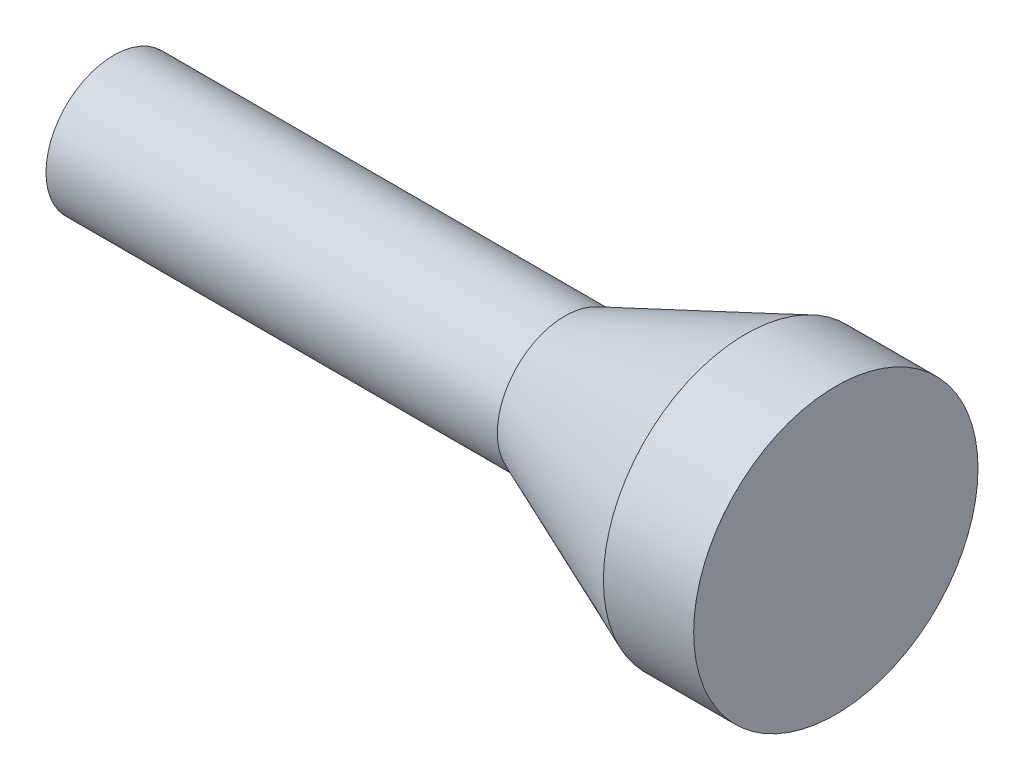
ISO-10303-21;
HEADER;
FILE_DESCRIPTION(('STEP AP214'),'2;1');
FILE_NAME('part.step','',(''),(''),'','','');
FILE_SCHEMA(('AUTOMOTIVE_DESIGN { 1 0 10303 214 1 1 1 1 }'));
ENDSEC;
DATA;
#1=APPLICATION_CONTEXT('core data for automotive mechanical design processes');
#2=APPLICATION_PROTOCOL_DEFINITION('international standard','automotive_design',2000,#1);
#3=PRODUCT_CONTEXT('',#1,'mechanical');
#4=PRODUCT('Part','Part','',(#3));
#5=PRODUCT_RELATED_PRODUCT_CATEGORY('part','',(#4));
#6=PRODUCT_DEFINITION_FORMATION('','',#4);
#7=PRODUCT_DEFINITION_CONTEXT('part definition',#1,'design');
#8=PRODUCT_DEFINITION('design','',#6,#7);
#9=PRODUCT_DEFINITION_SHAPE('','',#8);
#10=(LENGTH_UNIT() NAMED_UNIT(*) SI_UNIT(.MILLI.,.METRE.));
#11=(NAMED_UNIT(*) PLANE_ANGLE_UNIT() SI_UNIT($,.RADIAN.));
#12=(NAMED_UNIT(*) SI_UNIT($,.STERADIAN.) SOLID_ANGLE_UNIT());
#13=UNCERTAINTY_MEASURE_WITH_UNIT(LENGTH_MEASURE(1.E-05),#10,'distance_accuracy_value','');
#14=(GEOMETRIC_REPRESENTATION_CONTEXT(3) GLOBAL_UNCERTAINTY_ASSIGNED_CONTEXT((#13)) GLOBAL_UNIT_ASSIGNED_CONTEXT((#10,
#11,#12)) REPRESENTATION_CONTEXT('',''));
#15=CARTESIAN_POINT('',(0.,0.,0.));
#16=DIRECTION('',(0.,0.,1.));
#17=DIRECTION('',(1.,0.,0.));
#18=AXIS2_PLACEMENT_3D('',#15,#16,#17);
#19=CARTESIAN_POINT('',(190.5,0.,0.));
#20=DIRECTION('',(-1.,0.,0.));
#21=DIRECTION('',(0.,0.,1.));
#22=AXIS2_PLACEMENT_3D('',#19,#20,#21);
#23=PLANE('',#22);
#24=CARTESIAN_POINT('',(190.5,0.,0.));
#25=DIRECTION('',(-1.,0.,0.));
#26=DIRECTION('',(0.,0.,1.));
#27=AXIS2_PLACEMENT_3D('',#24,#25,#26);
#28=CIRCLE('',#27,80.01);
#29=CARTESIAN_POINT('',(190.5,0.,80.01));
#30=VERTEX_POINT('',#29);
#31=EDGE_CURVE('E10',#30,#30,#28,.T.);
#32=ORIENTED_EDGE('',*,*,#31,.F.);
#33=EDGE_LOOP('',(#32));
#34=FACE_BOUND('',#33,.T.);
#35=ADVANCED_FACE('F42',(#34),#23,.F.);
#36=CARTESIAN_POINT('',(-88.99,0.,0.));
#37=DIRECTION('',(-1.,0.,0.));
#38=DIRECTION('',(0.,0.,1.));
#39=AXIS2_PLACEMENT_3D('',#36,#37,#38);
#40=CYLINDRICAL_SURFACE('',#39,80.01);
#41=CARTESIAN_POINT('',(139.7,0.,0.));
#42=DIRECTION('',(-1.,0.,0.));
#43=DIRECTION('',(0.,0.,1.));
#44=AXIS2_PLACEMENT_3D('',#41,#42,#43);
#45=CIRCLE('',#44,80.01);
#46=CARTESIAN_POINT('',(139.7,0.,80.01));
#47=VERTEX_POINT('',#46);
#48=EDGE_CURVE('E49',#47,#47,#45,.T.);
#49=ORIENTED_EDGE('',*,*,#48,.F.);
#50=EDGE_LOOP('',(#49));
#51=FACE_BOUND('',#50,.T.);
#52=ORIENTED_EDGE('',*,*,#31,.T.);
#53=EDGE_LOOP('',(#52));
#54=FACE_BOUND('',#53,.T.);
#55=ADVANCED_FACE('F83',(#51,#54),#40,.T.);
#56=CARTESIAN_POINT('',(139.7,0.,0.));
#57=DIRECTION('',(1.,0.,0.));
#58=DIRECTION('',(0.,0.,-1.));
#59=AXIS2_PLACEMENT_3D('',#56,#57,#58);
#60=CONICAL_SURFACE('',#59,80.01,0.391235579127174);
#61=CARTESIAN_POINT('',(38.1,0.,0.));
#62=DIRECTION('',(-1.,0.,0.));
#63=DIRECTION('',(0.,0.,1.));
#64=AXIS2_PLACEMENT_3D('',#61,#62,#63);
#65=CIRCLE('',#64,38.1);
#66=CARTESIAN_POINT('',(38.1,0.,38.1));
#67=VERTEX_POINT('',#66);
#68=EDGE_CURVE('E57',#67,#67,#65,.T.);
#69=ORIENTED_EDGE('',*,*,#68,.F.);
#70=EDGE_LOOP('',(#69));
#71=FACE_BOUND('',#70,.T.);
#72=ORIENTED_EDGE('',*,*,#48,.T.);
#73=EDGE_LOOP('',(#72));
#74=FACE_BOUND('',#73,.T.);
#75=ADVANCED_FACE('F78',(#71,#74),#60,.T.);
#76=CARTESIAN_POINT('',(-88.99,0.,0.));
#77=DIRECTION('',(-1.,0.,0.));
#78=DIRECTION('',(0.,0.,1.));
#79=AXIS2_PLACEMENT_3D('',#76,#77,#78);
#80=CYLINDRICAL_SURFACE('',#79,38.1);
#81=CARTESIAN_POINT('',(-215.9,0.,0.));
#82=DIRECTION('',(-1.,0.,0.));
#83=DIRECTION('',(0.,0.,1.));
#84=AXIS2_PLACEMENT_3D('',#81,#82,#83);
#85=CIRCLE('',#84,38.1);
#86=CARTESIAN_POINT('',(-215.9,0.,38.1));
#87=VERTEX_POINT('',#86);
#88=EDGE_CURVE('E64',#87,#87,#85,.T.);
#89=ORIENTED_EDGE('',*,*,#88,.F.);
#90=EDGE_LOOP('',(#89));
#91=FACE_BOUND('',#90,.T.);
#92=ORIENTED_EDGE('',*,*,#68,.T.);
#93=EDGE_LOOP('',(#92));
#94=FACE_BOUND('',#93,.T.);
#95=ADVANCED_FACE('F75',(#91,#94),#80,.T.);
#96=CARTESIAN_POINT('',(-215.9,38.1,0.));
#97=DIRECTION('',(1.,0.,0.));
#98=DIRECTION('',(0.,0.,-1.));
#99=AXIS2_PLACEMENT_3D('',#96,#97,#98);
#100=PLANE('',#99);
#101=ORIENTED_EDGE('',*,*,#88,.T.);
#102=EDGE_LOOP('',(#101));
#103=FACE_BOUND('',#102,.T.);
#104=ADVANCED_FACE('F73',(#103),#100,.F.);
#105=CLOSED_SHELL('',(#35,#55,#75,#95,#104));
#106=MANIFOLD_SOLID_BREP('B2',#105);
#107=ADVANCED_BREP_SHAPE_REPRESENTATION('',(#18,#106),#14);
#108=SHAPE_DEFINITION_REPRESENTATION(#9,#107);
ENDSEC;
END-ISO-10303-21;
